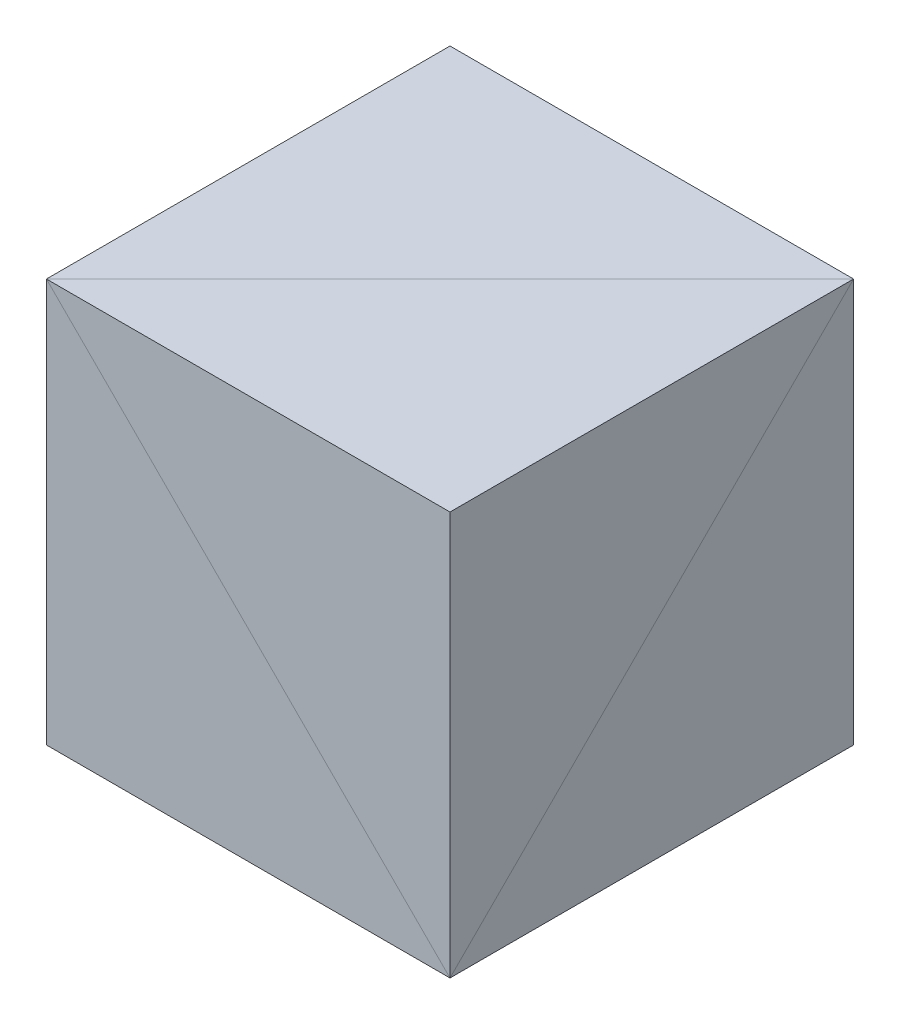
ISO-10303-21;
HEADER;
FILE_DESCRIPTION(('STEP AP214'),'2;1');
FILE_NAME('part.step','',(''),(''),'','','');
FILE_SCHEMA(('AUTOMOTIVE_DESIGN { 1 0 10303 214 1 1 1 1 }'));
ENDSEC;
DATA;
#1=APPLICATION_CONTEXT('core data for automotive mechanical design processes');
#2=APPLICATION_PROTOCOL_DEFINITION('international standard','automotive_design',2000,#1);
#3=PRODUCT_CONTEXT('',#1,'mechanical');
#4=PRODUCT('Part','Part','',(#3));
#5=PRODUCT_RELATED_PRODUCT_CATEGORY('part','',(#4));
#6=PRODUCT_DEFINITION_FORMATION('','',#4);
#7=PRODUCT_DEFINITION_CONTEXT('part definition',#1,'design');
#8=PRODUCT_DEFINITION('design','',#6,#7);
#9=PRODUCT_DEFINITION_SHAPE('','',#8);
#10=(LENGTH_UNIT() NAMED_UNIT(*) SI_UNIT(.MILLI.,.METRE.));
#11=(NAMED_UNIT(*) PLANE_ANGLE_UNIT() SI_UNIT($,.RADIAN.));
#12=(NAMED_UNIT(*) SI_UNIT($,.STERADIAN.) SOLID_ANGLE_UNIT());
#13=UNCERTAINTY_MEASURE_WITH_UNIT(LENGTH_MEASURE(1.E-05),#10,'distance_accuracy_value','');
#14=(GEOMETRIC_REPRESENTATION_CONTEXT(3) GLOBAL_UNCERTAINTY_ASSIGNED_CONTEXT((#13)) GLOBAL_UNIT_ASSIGNED_CONTEXT((#10,
#11,#12)) REPRESENTATION_CONTEXT('',''));
#15=CARTESIAN_POINT('',(0.,0.,0.));
#16=DIRECTION('',(0.,0.,1.));
#17=DIRECTION('',(1.,0.,0.));
#18=AXIS2_PLACEMENT_3D('',#15,#16,#17);
#19=CARTESIAN_POINT('',(13.3333333333333,13.3333333333333,13.3333333333333));
#20=DIRECTION('',(0.577350269189626,0.577350269189626,0.577350269189626));
#21=DIRECTION('',(0.,-0.707106781186547,0.707106781186548));
#22=AXIS2_PLACEMENT_3D('',#19,#20,#21);
#23=PLANE('',#22);
#24=DIRECTION('',(0.,0.707106781186548,-0.707106781186548));
#25=VECTOR('',#24,1.);
#26=CARTESIAN_POINT('',(20.,-20.,40.));
#27=LINE('',#26,#25);
#28=CARTESIAN_POINT('',(20.,-20.,40.));
#29=VERTEX_POINT('',#28);
#30=CARTESIAN_POINT('',(20.,20.,0.));
#31=VERTEX_POINT('',#30);
#32=EDGE_CURVE('E87',#29,#31,#27,.T.);
#33=ORIENTED_EDGE('',*,*,#32,.F.);
#34=DIRECTION('',(0.707106781186548,-0.707106781186547,0.));
#35=VECTOR('',#34,1.);
#36=CARTESIAN_POINT('',(-20.,20.,40.));
#37=LINE('',#36,#35);
#38=CARTESIAN_POINT('',(-20.,20.,40.));
#39=VERTEX_POINT('',#38);
#40=EDGE_CURVE('E88',#39,#29,#37,.T.);
#41=ORIENTED_EDGE('',*,*,#40,.F.);
#42=DIRECTION('',(-0.707106781186548,0.,0.707106781186548));
#43=VECTOR('',#42,1.);
#44=CARTESIAN_POINT('',(20.,20.,0.));
#45=LINE('',#44,#43);
#46=EDGE_CURVE('E85',#31,#39,#45,.T.);
#47=ORIENTED_EDGE('',*,*,#46,.F.);
#48=EDGE_LOOP('',(#33,#41,#47));
#49=FACE_BOUND('',#48,.T.);
#50=ADVANCED_FACE('F54',(#49),#23,.F.);
#51=CARTESIAN_POINT('',(0.,20.,0.));
#52=DIRECTION('',(0.,-1.,0.));
#53=DIRECTION('',(0.,0.,-1.));
#54=AXIS2_PLACEMENT_3D('',#51,#52,#53);
#55=PLANE('',#54);
#56=DIRECTION('',(1.,0.,0.));
#57=VECTOR('',#56,1.);
#58=CARTESIAN_POINT('',(-20.,20.,40.));
#59=LINE('',#58,#57);
#60=CARTESIAN_POINT('',(20.,20.,40.));
#61=VERTEX_POINT('',#60);
#62=EDGE_CURVE('E102',#39,#61,#59,.T.);
#63=ORIENTED_EDGE('',*,*,#62,.T.);
#64=DIRECTION('',(0.,0.,1.));
#65=VECTOR('',#64,1.);
#66=CARTESIAN_POINT('',(20.,20.,0.));
#67=LINE('',#66,#65);
#68=EDGE_CURVE('E66',#31,#61,#67,.T.);
#69=ORIENTED_EDGE('',*,*,#68,.F.);
#70=ORIENTED_EDGE('',*,*,#46,.T.);
#71=EDGE_LOOP('',(#63,#69,#70));
#72=FACE_BOUND('',#71,.T.);
#73=ADVANCED_FACE('F101',(#72),#55,.F.);
#74=CARTESIAN_POINT('',(20.,0.,0.));
#75=DIRECTION('',(-1.,0.,0.));
#76=DIRECTION('',(0.,-1.,0.));
#77=AXIS2_PLACEMENT_3D('',#74,#75,#76);
#78=PLANE('',#77);
#79=ORIENTED_EDGE('',*,*,#68,.T.);
#80=DIRECTION('',(0.,1.,0.));
#81=VECTOR('',#80,1.);
#82=CARTESIAN_POINT('',(20.,-20.,40.));
#83=LINE('',#82,#81);
#84=EDGE_CURVE('E13',#29,#61,#83,.T.);
#85=ORIENTED_EDGE('',*,*,#84,.F.);
#86=ORIENTED_EDGE('',*,*,#32,.T.);
#87=EDGE_LOOP('',(#79,#85,#86));
#88=FACE_BOUND('',#87,.T.);
#89=ADVANCED_FACE('F97',(#88),#78,.F.);
#90=CARTESIAN_POINT('',(0.,0.,40.));
#91=DIRECTION('',(0.,0.,-1.));
#92=DIRECTION('',(-1.,0.,0.));
#93=AXIS2_PLACEMENT_3D('',#90,#91,#92);
#94=PLANE('',#93);
#95=ORIENTED_EDGE('',*,*,#84,.T.);
#96=ORIENTED_EDGE('',*,*,#62,.F.);
#97=ORIENTED_EDGE('',*,*,#40,.T.);
#98=EDGE_LOOP('',(#95,#96,#97));
#99=FACE_BOUND('',#98,.T.);
#100=ADVANCED_FACE('F56',(#99),#94,.F.);
#101=CLOSED_SHELL('',(#50,#73,#89,#100));
#102=MANIFOLD_SOLID_BREP('B2',#101);
#103=CARTESIAN_POINT('',(20.,20.,40.));
#104=DIRECTION('',(-1.,0.,0.));
#105=DIRECTION('',(0.,-1.,0.));
#106=AXIS2_PLACEMENT_3D('',#103,#104,#105);
#107=PLANE('',#106);
#108=DIRECTION('',(0.,1.,0.));
#109=VECTOR('',#108,1.);
#110=CARTESIAN_POINT('',(20.,20.,0.));
#111=LINE('',#110,#109);
#112=CARTESIAN_POINT('',(20.,-20.,0.));
#113=VERTEX_POINT('',#112);
#114=CARTESIAN_POINT('',(20.,20.,0.));
#115=VERTEX_POINT('',#114);
#116=EDGE_CURVE('E261',#113,#115,#111,.T.);
#117=ORIENTED_EDGE('',*,*,#116,.T.);
#118=DIRECTION('',(0.,0.,-1.));
#119=VECTOR('',#118,1.);
#120=CARTESIAN_POINT('',(20.,20.,40.));
#121=LINE('',#120,#119);
#122=CARTESIAN_POINT('',(20.,20.,40.));
#123=VERTEX_POINT('',#122);
#124=EDGE_CURVE('E52',#123,#115,#121,.T.);
#125=ORIENTED_EDGE('',*,*,#124,.F.);
#126=DIRECTION('',(0.,1.,0.));
#127=VECTOR('',#126,1.);
#128=CARTESIAN_POINT('',(20.,20.,40.));
#129=LINE('',#128,#127);
#130=CARTESIAN_POINT('',(20.,-20.,40.));
#131=VERTEX_POINT('',#130);
#132=EDGE_CURVE('E249',#131,#123,#129,.T.);
#133=ORIENTED_EDGE('',*,*,#132,.F.);
#134=DIRECTION('',(0.,0.,-1.));
#135=VECTOR('',#134,1.);
#136=CARTESIAN_POINT('',(20.,-20.,40.));
#137=LINE('',#136,#135);
#138=EDGE_CURVE('E257',#131,#113,#137,.T.);
#139=ORIENTED_EDGE('',*,*,#138,.T.);
#140=EDGE_LOOP('',(#117,#125,#133,#139));
#141=FACE_BOUND('',#140,.T.);
#142=ADVANCED_FACE('F198',(#141),#107,.F.);
#143=CARTESIAN_POINT('',(-20.,20.,40.));
#144=DIRECTION('',(0.,-1.,0.));
#145=DIRECTION('',(0.,0.,-1.));
#146=AXIS2_PLACEMENT_3D('',#143,#144,#145);
#147=PLANE('',#146);
#148=DIRECTION('',(-1.,0.,0.));
#149=VECTOR('',#148,1.);
#150=CARTESIAN_POINT('',(-20.,20.,0.));
#151=LINE('',#150,#149);
#152=CARTESIAN_POINT('',(-20.,20.,0.));
#153=VERTEX_POINT('',#152);
#154=EDGE_CURVE('E253',#115,#153,#151,.T.);
#155=ORIENTED_EDGE('',*,*,#154,.T.);
#156=DIRECTION('',(0.,0.,-1.));
#157=VECTOR('',#156,1.);
#158=CARTESIAN_POINT('',(-20.,20.,40.));
#159=LINE('',#158,#157);
#160=CARTESIAN_POINT('',(-20.,20.,40.));
#161=VERTEX_POINT('',#160);
#162=EDGE_CURVE('E206',#161,#153,#159,.T.);
#163=ORIENTED_EDGE('',*,*,#162,.F.);
#164=DIRECTION('',(-1.,0.,0.));
#165=VECTOR('',#164,1.);
#166=CARTESIAN_POINT('',(-20.,20.,40.));
#167=LINE('',#166,#165);
#168=EDGE_CURVE('E244',#123,#161,#167,.T.);
#169=ORIENTED_EDGE('',*,*,#168,.F.);
#170=ORIENTED_EDGE('',*,*,#124,.T.);
#171=EDGE_LOOP('',(#155,#163,#169,#170));
#172=FACE_BOUND('',#171,.T.);
#173=ADVANCED_FACE('F252',(#172),#147,.F.);
#174=CARTESIAN_POINT('',(-20.,20.,40.));
#175=DIRECTION('',(1.,0.,0.));
#176=DIRECTION('',(0.,1.,0.));
#177=AXIS2_PLACEMENT_3D('',#174,#175,#176);
#178=PLANE('',#177);
#179=DIRECTION('',(0.,-1.,0.));
#180=VECTOR('',#179,1.);
#181=CARTESIAN_POINT('',(-20.,20.,0.));
#182=LINE('',#181,#180);
#183=CARTESIAN_POINT('',(-20.,-20.,0.));
#184=VERTEX_POINT('',#183);
#185=EDGE_CURVE('E231',#153,#184,#182,.T.);
#186=ORIENTED_EDGE('',*,*,#185,.T.);
#187=DIRECTION('',(0.,0.,-1.));
#188=VECTOR('',#187,1.);
#189=CARTESIAN_POINT('',(-20.,-20.,40.));
#190=LINE('',#189,#188);
#191=CARTESIAN_POINT('',(-20.,-20.,40.));
#192=VERTEX_POINT('',#191);
#193=EDGE_CURVE('E254',#192,#184,#190,.T.);
#194=ORIENTED_EDGE('',*,*,#193,.F.);
#195=DIRECTION('',(0.,-1.,0.));
#196=VECTOR('',#195,1.);
#197=CARTESIAN_POINT('',(-20.,20.,40.));
#198=LINE('',#197,#196);
#199=EDGE_CURVE('E247',#161,#192,#198,.T.);
#200=ORIENTED_EDGE('',*,*,#199,.F.);
#201=ORIENTED_EDGE('',*,*,#162,.T.);
#202=EDGE_LOOP('',(#186,#194,#200,#201));
#203=FACE_BOUND('',#202,.T.);
#204=ADVANCED_FACE('F255',(#203),#178,.F.);
#205=CARTESIAN_POINT('',(-20.,-20.,40.));
#206=DIRECTION('',(0.,1.,0.));
#207=DIRECTION('',(0.,0.,1.));
#208=AXIS2_PLACEMENT_3D('',#205,#206,#207);
#209=PLANE('',#208);
#210=DIRECTION('',(1.,0.,0.));
#211=VECTOR('',#210,1.);
#212=CARTESIAN_POINT('',(-20.,-20.,0.));
#213=LINE('',#212,#211);
#214=EDGE_CURVE('E237',#184,#113,#213,.T.);
#215=ORIENTED_EDGE('',*,*,#214,.T.);
#216=ORIENTED_EDGE('',*,*,#138,.F.);
#217=DIRECTION('',(1.,0.,0.));
#218=VECTOR('',#217,1.);
#219=CARTESIAN_POINT('',(-20.,-20.,40.));
#220=LINE('',#219,#218);
#221=EDGE_CURVE('E214',#192,#131,#220,.T.);
#222=ORIENTED_EDGE('',*,*,#221,.F.);
#223=ORIENTED_EDGE('',*,*,#193,.T.);
#224=EDGE_LOOP('',(#215,#216,#222,#223));
#225=FACE_BOUND('',#224,.T.);
#226=ADVANCED_FACE('F268',(#225),#209,.F.);
#227=CARTESIAN_POINT('',(0.,0.,40.));
#228=DIRECTION('',(0.,0.,1.));
#229=DIRECTION('',(1.,0.,0.));
#230=AXIS2_PLACEMENT_3D('',#227,#228,#229);
#231=PLANE('',#230);
#232=ORIENTED_EDGE('',*,*,#132,.T.);
#233=ORIENTED_EDGE('',*,*,#168,.T.);
#234=ORIENTED_EDGE('',*,*,#199,.T.);
#235=ORIENTED_EDGE('',*,*,#221,.T.);
#236=EDGE_LOOP('',(#232,#233,#234,#235));
#237=FACE_BOUND('',#236,.T.);
#238=ADVANCED_FACE('F245',(#237),#231,.T.);
#239=CARTESIAN_POINT('',(0.,0.,0.));
#240=DIRECTION('',(0.,0.,1.));
#241=DIRECTION('',(1.,0.,0.));
#242=AXIS2_PLACEMENT_3D('',#239,#240,#241);
#243=PLANE('',#242);
#244=ORIENTED_EDGE('',*,*,#116,.F.);
#245=ORIENTED_EDGE('',*,*,#214,.F.);
#246=ORIENTED_EDGE('',*,*,#185,.F.);
#247=ORIENTED_EDGE('',*,*,#154,.F.);
#248=EDGE_LOOP('',(#244,#245,#246,#247));
#249=FACE_BOUND('',#248,.T.);
#250=ADVANCED_FACE('F271',(#249),#243,.F.);
#251=CLOSED_SHELL('',(#142,#173,#204,#226,#238,#250));
#252=MANIFOLD_SOLID_BREP('B7_NOT_SHOWN',#251);
#253=ADVANCED_BREP_SHAPE_REPRESENTATION('',(#18,#102,#252),#14);
#254=SHAPE_DEFINITION_REPRESENTATION(#9,#253);
ENDSEC;
END-ISO-10303-21;
